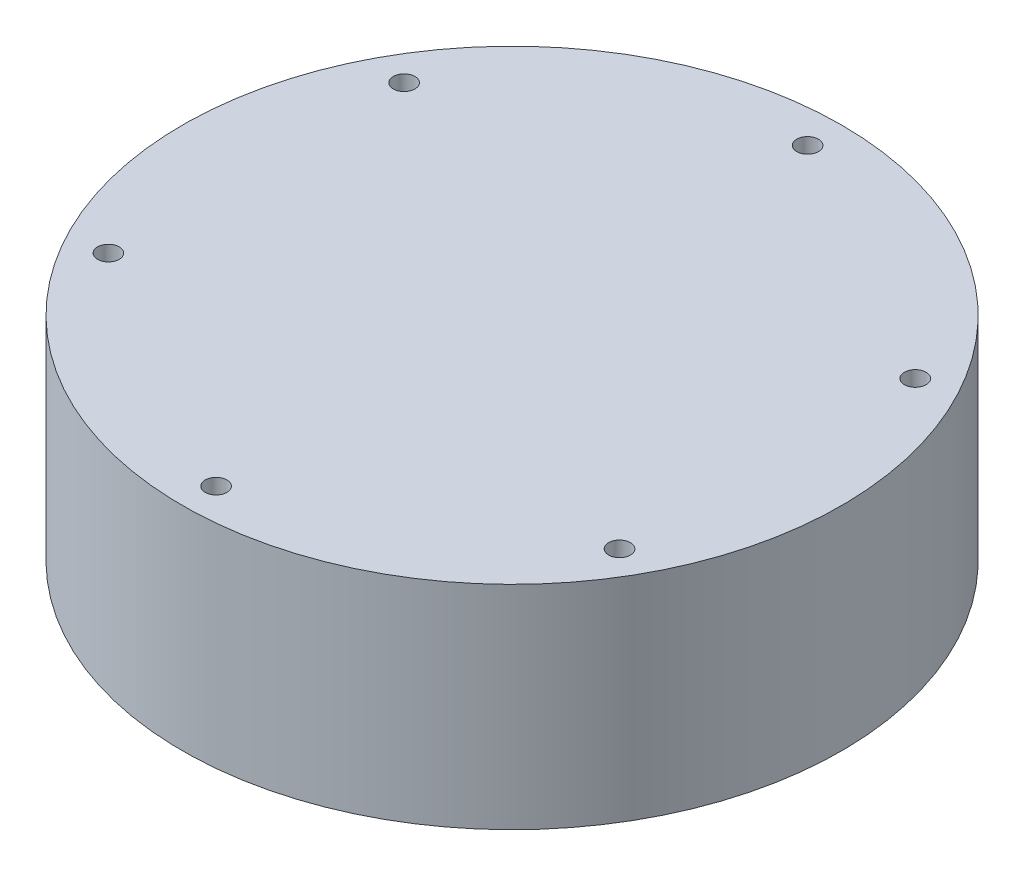
ISO-10303-21;
HEADER;
FILE_DESCRIPTION(('STEP AP214'),'2;1');
FILE_NAME('part.step','',(''),(''),'','','');
FILE_SCHEMA(('AUTOMOTIVE_DESIGN { 1 0 10303 214 1 1 1 1 }'));
ENDSEC;
DATA;
#1=APPLICATION_CONTEXT('core data for automotive mechanical design processes');
#2=APPLICATION_PROTOCOL_DEFINITION('international standard','automotive_design',2000,#1);
#3=PRODUCT_CONTEXT('',#1,'mechanical');
#4=PRODUCT('Part','Part','',(#3));
#5=PRODUCT_RELATED_PRODUCT_CATEGORY('part','',(#4));
#6=PRODUCT_DEFINITION_FORMATION('','',#4);
#7=PRODUCT_DEFINITION_CONTEXT('part definition',#1,'design');
#8=PRODUCT_DEFINITION('design','',#6,#7);
#9=PRODUCT_DEFINITION_SHAPE('','',#8);
#10=(LENGTH_UNIT() NAMED_UNIT(*) SI_UNIT(.MILLI.,.METRE.));
#11=(NAMED_UNIT(*) PLANE_ANGLE_UNIT() SI_UNIT($,.RADIAN.));
#12=(NAMED_UNIT(*) SI_UNIT($,.STERADIAN.) SOLID_ANGLE_UNIT());
#13=UNCERTAINTY_MEASURE_WITH_UNIT(LENGTH_MEASURE(1.E-05),#10,'distance_accuracy_value','');
#14=(GEOMETRIC_REPRESENTATION_CONTEXT(3) GLOBAL_UNCERTAINTY_ASSIGNED_CONTEXT((#13)) GLOBAL_UNIT_ASSIGNED_CONTEXT((#10,
#11,#12)) REPRESENTATION_CONTEXT('',''));
#15=CARTESIAN_POINT('',(0.,0.,0.));
#16=DIRECTION('',(0.,0.,1.));
#17=DIRECTION('',(1.,0.,0.));
#18=AXIS2_PLACEMENT_3D('',#15,#16,#17);
#19=CARTESIAN_POINT('',(0.,1.1,10.));
#20=DIRECTION('',(0.,-1.,0.));
#21=DIRECTION('',(0.,0.,-1.));
#22=AXIS2_PLACEMENT_3D('',#19,#20,#21);
#23=PLANE('',#22);
#24=CARTESIAN_POINT('',(0.,1.1,10.));
#25=DIRECTION('',(0.,-1.,0.));
#26=DIRECTION('',(0.,0.,-1.));
#27=AXIS2_PLACEMENT_3D('',#24,#25,#26);
#28=CIRCLE('',#27,1.5);
#29=CARTESIAN_POINT('',(0.,1.1,8.5));
#30=VERTEX_POINT('',#29);
#31=EDGE_CURVE('E19',#30,#30,#28,.T.);
#32=ORIENTED_EDGE('',*,*,#31,.T.);
#33=EDGE_LOOP('',(#32));
#34=FACE_BOUND('',#33,.T.);
#35=ADVANCED_FACE('F16',(#34),#23,.T.);
#36=CARTESIAN_POINT('',(-4.9632848167397,3.49999999997408,8.59666147502877));
#37=DIRECTION('',(0.,-1.,0.));
#38=DIRECTION('',(1.,0.,0.));
#39=AXIS2_PLACEMENT_3D('',#36,#37,#38);
#40=CONICAL_SURFACE('',#39,1.24999999994599,1.02974425862451);
#41=CARTESIAN_POINT('',(-4.9632848167397,4.25107577373751,8.59666147497192));
#42=VERTEX_POINT('',#41);
#43=VERTEX_LOOP('',#42);
#44=FACE_BOUND('',#43,.T.);
#45=CARTESIAN_POINT('',(-4.9632848167397,3.5,8.59666147502877));
#46=DIRECTION('',(0.,-1.,0.));
#47=DIRECTION('',(0.,0.,-1.));
#48=AXIS2_PLACEMENT_3D('',#45,#46,#47);
#49=CIRCLE('',#48,1.24999999999999);
#50=CARTESIAN_POINT('',(-4.9632848167397,3.5,7.34666147502877));
#51=VERTEX_POINT('',#50);
#52=EDGE_CURVE('E86',#51,#51,#49,.T.);
#53=ORIENTED_EDGE('',*,*,#52,.T.);
#54=EDGE_LOOP('',(#53));
#55=FACE_BOUND('',#54,.T.);
#56=ADVANCED_FACE('F80',(#44,#55),#40,.F.);
#57=CARTESIAN_POINT('',(-9.88985445021947,3.50000000003092,-0.0635925628154066));
#58=DIRECTION('',(0.,-1.,0.));
#59=DIRECTION('',(0.,0.,-1.));
#60=AXIS2_PLACEMENT_3D('',#57,#58,#59);
#61=CONICAL_SURFACE('',#60,1.25000000002218,1.02974425867833);
#62=CARTESIAN_POINT('',(-9.88985445021947,4.25107577382278,-0.0635925628154066));
#63=VERTEX_POINT('',#62);
#64=VERTEX_LOOP('',#63);
#65=FACE_BOUND('',#64,.T.);
#66=CARTESIAN_POINT('',(-9.88985445021947,3.5,-0.0635925628154066));
#67=DIRECTION('',(0.,-1.,0.));
#68=DIRECTION('',(0.,0.,-1.));
#69=AXIS2_PLACEMENT_3D('',#66,#67,#68);
#70=CIRCLE('',#69,1.24999999999999);
#71=CARTESIAN_POINT('',(-9.88985445021947,3.5,-1.3135925628154));
#72=VERTEX_POINT('',#71);
#73=EDGE_CURVE('E88',#72,#72,#70,.T.);
#74=ORIENTED_EDGE('',*,*,#73,.T.);
#75=EDGE_LOOP('',(#74));
#76=FACE_BOUND('',#75,.T.);
#77=ADVANCED_FACE('F83',(#65,#76),#61,.F.);
#78=CARTESIAN_POINT('',(-4.85313926695954,3.49999999997408,-8.66025403784397));
#79=DIRECTION('',(0.,-1.,0.));
#80=DIRECTION('',(1.,0.,0.));
#81=AXIS2_PLACEMENT_3D('',#78,#79,#80);
#82=CONICAL_SURFACE('',#81,1.25000000004684,1.02974425868194);
#83=CARTESIAN_POINT('',(-4.85313926695954,4.25107577376593,-8.66025403784397));
#84=VERTEX_POINT('',#83);
#85=VERTEX_LOOP('',#84);
#86=FACE_BOUND('',#85,.T.);
#87=CARTESIAN_POINT('',(-4.85313926695954,3.5,-8.66025403784397));
#88=DIRECTION('',(0.,-1.,0.));
#89=DIRECTION('',(0.,0.,-1.));
#90=AXIS2_PLACEMENT_3D('',#87,#88,#89);
#91=CIRCLE('',#90,1.24999999999999);
#92=CARTESIAN_POINT('',(-4.85313926695954,3.5,-9.91025403784396));
#93=VERTEX_POINT('',#92);
#94=EDGE_CURVE('E91',#93,#93,#91,.T.);
#95=ORIENTED_EDGE('',*,*,#94,.T.);
#96=EDGE_LOOP('',(#95));
#97=FACE_BOUND('',#96,.T.);
#98=ADVANCED_FACE('F193',(#86,#97),#82,.F.);
#99=CARTESIAN_POINT('',(5.11014554978017,3.50000000008777,-8.59666147502835));
#100=DIRECTION('',(0.,-1.,0.));
#101=DIRECTION('',(0.,0.,-1.));
#102=AXIS2_PLACEMENT_3D('',#99,#100,#101);
#103=CONICAL_SURFACE('',#102,1.24999999976794,1.0297442583717);
#104=CARTESIAN_POINT('',(5.11014554978017,4.2510757738512,-8.59666147505678));
#105=VERTEX_POINT('',#104);
#106=VERTEX_LOOP('',#105);
#107=FACE_BOUND('',#106,.T.);
#108=CARTESIAN_POINT('',(5.11014554978017,3.5,-8.59666147502835));
#109=DIRECTION('',(0.,-1.,0.));
#110=DIRECTION('',(0.,0.,-1.));
#111=AXIS2_PLACEMENT_3D('',#108,#109,#110);
#112=CIRCLE('',#111,1.24999999999999);
#113=CARTESIAN_POINT('',(5.11014554978017,3.5,-9.84666147502835));
#114=VERTEX_POINT('',#113);
#115=EDGE_CURVE('E184',#114,#114,#112,.T.);
#116=ORIENTED_EDGE('',*,*,#115,.T.);
#117=EDGE_LOOP('',(#116));
#118=FACE_BOUND('',#117,.T.);
#119=ADVANCED_FACE('F359',(#107,#118),#103,.F.);
#120=CARTESIAN_POINT('',(10.0367151832599,3.49999999991724,0.0635925628158212));
#121=DIRECTION('',(0.,-1.,0.));
#122=DIRECTION('',(0.,0.,-1.));
#123=AXIS2_PLACEMENT_3D('',#120,#121,#122);
#124=CONICAL_SURFACE('',#123,1.25000000003281,1.02974425866186);
#125=CARTESIAN_POINT('',(10.0367151832599,4.25107577370909,0.0635925628158212));
#126=VERTEX_POINT('',#125);
#127=VERTEX_LOOP('',#126);
#128=FACE_BOUND('',#127,.T.);
#129=CARTESIAN_POINT('',(10.0367151832599,3.5,0.0635925628158212));
#130=DIRECTION('',(0.,-1.,0.));
#131=DIRECTION('',(0.,0.,-1.));
#132=AXIS2_PLACEMENT_3D('',#129,#130,#131);
#133=CIRCLE('',#132,1.24999999999999);
#134=CARTESIAN_POINT('',(10.0367151832599,3.5,-1.18640743718417));
#135=VERTEX_POINT('',#134);
#136=EDGE_CURVE('E179',#135,#135,#133,.T.);
#137=ORIENTED_EDGE('',*,*,#136,.T.);
#138=EDGE_LOOP('',(#137));
#139=FACE_BOUND('',#138,.T.);
#140=ADVANCED_FACE('F356',(#128,#139),#124,.F.);
#141=CARTESIAN_POINT('',(5.00000000000001,3.49999999997408,8.66025403784438));
#142=DIRECTION('',(0.,-1.,0.));
#143=DIRECTION('',(1.,0.,0.));
#144=AXIS2_PLACEMENT_3D('',#141,#142,#143);
#145=CONICAL_SURFACE('',#144,1.2499999999513,1.02974425864834);
#146=CARTESIAN_POINT('',(5.00000000000001,4.25107577376593,8.66025403784438));
#147=VERTEX_POINT('',#146);
#148=VERTEX_LOOP('',#147);
#149=FACE_BOUND('',#148,.T.);
#150=CARTESIAN_POINT('',(5.00000000000001,3.5,8.66025403784438));
#151=DIRECTION('',(0.,-1.,0.));
#152=DIRECTION('',(0.,0.,-1.));
#153=AXIS2_PLACEMENT_3D('',#150,#151,#152);
#154=CIRCLE('',#153,1.24999999999999);
#155=CARTESIAN_POINT('',(5.00000000000001,3.5,7.41025403784439));
#156=VERTEX_POINT('',#155);
#157=EDGE_CURVE('E175',#156,#156,#154,.T.);
#158=ORIENTED_EDGE('',*,*,#157,.T.);
#159=EDGE_LOOP('',(#158));
#160=FACE_BOUND('',#159,.T.);
#161=ADVANCED_FACE('F358',(#149,#160),#145,.F.);
#162=CARTESIAN_POINT('',(0.,0.,0.));
#163=DIRECTION('',(0.,-1.,0.));
#164=DIRECTION('',(0.,0.,-1.));
#165=AXIS2_PLACEMENT_3D('',#162,#163,#164);
#166=PLANE('',#165);
#167=CARTESIAN_POINT('',(0.,0.,0.));
#168=DIRECTION('',(0.,-1.,0.));
#169=DIRECTION('',(0.,0.,-1.));
#170=AXIS2_PLACEMENT_3D('',#167,#168,#169);
#171=CIRCLE('',#170,4.5);
#172=CARTESIAN_POINT('',(0.,0.,-4.5));
#173=VERTEX_POINT('',#172);
#174=EDGE_CURVE('E173',#173,#173,#171,.T.);
#175=ORIENTED_EDGE('',*,*,#174,.T.);
#176=EDGE_LOOP('',(#175));
#177=FACE_BOUND('',#176,.T.);
#178=ADVANCED_FACE('F366',(#177),#166,.T.);
#179=CARTESIAN_POINT('',(0.,1.1,10.));
#180=DIRECTION('',(0.,-1.,0.));
#181=DIRECTION('',(0.,0.,-1.));
#182=AXIS2_PLACEMENT_3D('',#179,#180,#181);
#183=CYLINDRICAL_SURFACE('',#182,1.5);
#184=CARTESIAN_POINT('',(0.,-1.5,10.));
#185=DIRECTION('',(0.,-1.,0.));
#186=DIRECTION('',(0.,0.,-1.));
#187=AXIS2_PLACEMENT_3D('',#184,#185,#186);
#188=CIRCLE('',#187,1.5);
#189=CARTESIAN_POINT('',(0.,-1.5,8.5));
#190=VERTEX_POINT('',#189);
#191=EDGE_CURVE('E171',#190,#190,#188,.F.);
#192=ORIENTED_EDGE('',*,*,#191,.F.);
#193=EDGE_LOOP('',(#192));
#194=FACE_BOUND('',#193,.T.);
#195=ORIENTED_EDGE('',*,*,#31,.F.);
#196=EDGE_LOOP('',(#195));
#197=FACE_BOUND('',#196,.T.);
#198=ADVANCED_FACE('F417',(#194,#197),#183,.F.);
#199=CARTESIAN_POINT('',(-4.9632848167397,-1.5,8.59666147502877));
#200=DIRECTION('',(0.,-1.,0.));
#201=DIRECTION('',(0.,0.,-1.));
#202=AXIS2_PLACEMENT_3D('',#199,#200,#201);
#203=CYLINDRICAL_SURFACE('',#202,1.24999999999999);
#204=CARTESIAN_POINT('',(-4.9632848167397,-1.5,8.59666147502877));
#205=DIRECTION('',(0.,-1.,0.));
#206=DIRECTION('',(0.,0.,-1.));
#207=AXIS2_PLACEMENT_3D('',#204,#205,#206);
#208=CIRCLE('',#207,1.24999999999999);
#209=CARTESIAN_POINT('',(-4.9632848167397,-1.5,7.34666147502877));
#210=VERTEX_POINT('',#209);
#211=EDGE_CURVE('E168',#210,#210,#208,.F.);
#212=ORIENTED_EDGE('',*,*,#211,.F.);
#213=EDGE_LOOP('',(#212));
#214=FACE_BOUND('',#213,.T.);
#215=ORIENTED_EDGE('',*,*,#52,.F.);
#216=EDGE_LOOP('',(#215));
#217=FACE_BOUND('',#216,.T.);
#218=ADVANCED_FACE('F209',(#214,#217),#203,.F.);
#219=CARTESIAN_POINT('',(-9.88985445021947,-1.5,-0.0635925628154066));
#220=DIRECTION('',(0.,-1.,0.));
#221=DIRECTION('',(0.,0.,-1.));
#222=AXIS2_PLACEMENT_3D('',#219,#220,#221);
#223=CYLINDRICAL_SURFACE('',#222,1.24999999999999);
#224=CARTESIAN_POINT('',(-9.88985445021947,-1.5,-0.0635925628154066));
#225=DIRECTION('',(0.,-1.,0.));
#226=DIRECTION('',(0.,0.,-1.));
#227=AXIS2_PLACEMENT_3D('',#224,#225,#226);
#228=CIRCLE('',#227,1.24999999999999);
#229=CARTESIAN_POINT('',(-9.88985445021947,-1.5,-1.3135925628154));
#230=VERTEX_POINT('',#229);
#231=EDGE_CURVE('E165',#230,#230,#228,.F.);
#232=ORIENTED_EDGE('',*,*,#231,.F.);
#233=EDGE_LOOP('',(#232));
#234=FACE_BOUND('',#233,.T.);
#235=ORIENTED_EDGE('',*,*,#73,.F.);
#236=EDGE_LOOP('',(#235));
#237=FACE_BOUND('',#236,.T.);
#238=ADVANCED_FACE('F198',(#234,#237),#223,.F.);
#239=CARTESIAN_POINT('',(-4.85313926695954,-1.5,-8.66025403784397));
#240=DIRECTION('',(0.,-1.,0.));
#241=DIRECTION('',(0.,0.,-1.));
#242=AXIS2_PLACEMENT_3D('',#239,#240,#241);
#243=CYLINDRICAL_SURFACE('',#242,1.24999999999999);
#244=CARTESIAN_POINT('',(-4.85313926695954,-1.5,-8.66025403784397));
#245=DIRECTION('',(0.,-1.,0.));
#246=DIRECTION('',(0.,0.,-1.));
#247=AXIS2_PLACEMENT_3D('',#244,#245,#246);
#248=CIRCLE('',#247,1.24999999999999);
#249=CARTESIAN_POINT('',(-4.85313926695954,-1.5,-9.91025403784396));
#250=VERTEX_POINT('',#249);
#251=EDGE_CURVE('E162',#250,#250,#248,.F.);
#252=ORIENTED_EDGE('',*,*,#251,.F.);
#253=EDGE_LOOP('',(#252));
#254=FACE_BOUND('',#253,.T.);
#255=ORIENTED_EDGE('',*,*,#94,.F.);
#256=EDGE_LOOP('',(#255));
#257=FACE_BOUND('',#256,.T.);
#258=ADVANCED_FACE('F195',(#254,#257),#243,.F.);
#259=CARTESIAN_POINT('',(5.11014554978017,-1.5,-8.59666147502835));
#260=DIRECTION('',(0.,-1.,0.));
#261=DIRECTION('',(0.,0.,-1.));
#262=AXIS2_PLACEMENT_3D('',#259,#260,#261);
#263=CYLINDRICAL_SURFACE('',#262,1.24999999999999);
#264=CARTESIAN_POINT('',(5.11014554978017,-1.5,-8.59666147502835));
#265=DIRECTION('',(0.,-1.,0.));
#266=DIRECTION('',(0.,0.,-1.));
#267=AXIS2_PLACEMENT_3D('',#264,#265,#266);
#268=CIRCLE('',#267,1.24999999999999);
#269=CARTESIAN_POINT('',(5.11014554978017,-1.5,-9.84666147502835));
#270=VERTEX_POINT('',#269);
#271=EDGE_CURVE('E159',#270,#270,#268,.F.);
#272=ORIENTED_EDGE('',*,*,#271,.F.);
#273=EDGE_LOOP('',(#272));
#274=FACE_BOUND('',#273,.T.);
#275=ORIENTED_EDGE('',*,*,#115,.F.);
#276=EDGE_LOOP('',(#275));
#277=FACE_BOUND('',#276,.T.);
#278=ADVANCED_FACE('F197',(#274,#277),#263,.F.);
#279=CARTESIAN_POINT('',(10.0367151832599,-1.5,0.0635925628158212));
#280=DIRECTION('',(0.,-1.,0.));
#281=DIRECTION('',(0.,0.,-1.));
#282=AXIS2_PLACEMENT_3D('',#279,#280,#281);
#283=CYLINDRICAL_SURFACE('',#282,1.24999999999999);
#284=CARTESIAN_POINT('',(10.0367151832599,-1.5,0.0635925628158212));
#285=DIRECTION('',(0.,-1.,0.));
#286=DIRECTION('',(0.,0.,-1.));
#287=AXIS2_PLACEMENT_3D('',#284,#285,#286);
#288=CIRCLE('',#287,1.24999999999999);
#289=CARTESIAN_POINT('',(10.0367151832599,-1.5,-1.18640743718417));
#290=VERTEX_POINT('',#289);
#291=EDGE_CURVE('E156',#290,#290,#288,.F.);
#292=ORIENTED_EDGE('',*,*,#291,.F.);
#293=EDGE_LOOP('',(#292));
#294=FACE_BOUND('',#293,.T.);
#295=ORIENTED_EDGE('',*,*,#136,.F.);
#296=EDGE_LOOP('',(#295));
#297=FACE_BOUND('',#296,.T.);
#298=ADVANCED_FACE('F206',(#294,#297),#283,.F.);
#299=CARTESIAN_POINT('',(5.00000000000001,-1.5,8.66025403784438));
#300=DIRECTION('',(0.,-1.,0.));
#301=DIRECTION('',(0.,0.,-1.));
#302=AXIS2_PLACEMENT_3D('',#299,#300,#301);
#303=CYLINDRICAL_SURFACE('',#302,1.24999999999999);
#304=CARTESIAN_POINT('',(5.00000000000001,-1.5,8.66025403784438));
#305=DIRECTION('',(0.,-1.,0.));
#306=DIRECTION('',(0.,0.,-1.));
#307=AXIS2_PLACEMENT_3D('',#304,#305,#306);
#308=CIRCLE('',#307,1.24999999999999);
#309=CARTESIAN_POINT('',(5.00000000000001,-1.5,7.41025403784439));
#310=VERTEX_POINT('',#309);
#311=EDGE_CURVE('E153',#310,#310,#308,.F.);
#312=ORIENTED_EDGE('',*,*,#311,.F.);
#313=EDGE_LOOP('',(#312));
#314=FACE_BOUND('',#313,.T.);
#315=ORIENTED_EDGE('',*,*,#157,.F.);
#316=EDGE_LOOP('',(#315));
#317=FACE_BOUND('',#316,.T.);
#318=ADVANCED_FACE('F343',(#314,#317),#303,.F.);
#319=CARTESIAN_POINT('',(0.,0.,0.));
#320=DIRECTION('',(0.,-1.,0.));
#321=DIRECTION('',(0.,0.,-1.));
#322=AXIS2_PLACEMENT_3D('',#319,#320,#321);
#323=CYLINDRICAL_SURFACE('',#322,4.5);
#324=CARTESIAN_POINT('',(0.,-1.5,0.));
#325=DIRECTION('',(0.,-1.,0.));
#326=DIRECTION('',(0.,0.,-1.));
#327=AXIS2_PLACEMENT_3D('',#324,#325,#326);
#328=CIRCLE('',#327,4.5);
#329=CARTESIAN_POINT('',(0.,-1.5,-4.5));
#330=VERTEX_POINT('',#329);
#331=EDGE_CURVE('E150',#330,#330,#328,.F.);
#332=ORIENTED_EDGE('',*,*,#331,.F.);
#333=EDGE_LOOP('',(#332));
#334=FACE_BOUND('',#333,.T.);
#335=ORIENTED_EDGE('',*,*,#174,.F.);
#336=EDGE_LOOP('',(#335));
#337=FACE_BOUND('',#336,.T.);
#338=ADVANCED_FACE('F339',(#334,#337),#323,.F.);
#339=CARTESIAN_POINT('',(4.5,-1.5,0.));
#340=DIRECTION('',(0.,-1.,0.));
#341=DIRECTION('',(0.,0.,-1.));
#342=AXIS2_PLACEMENT_3D('',#339,#340,#341);
#343=PLANE('',#342);
#344=ORIENTED_EDGE('',*,*,#331,.T.);
#345=EDGE_LOOP('',(#344));
#346=FACE_BOUND('',#345,.T.);
#347=CARTESIAN_POINT('',(0.,-1.5,0.));
#348=DIRECTION('',(0.,-1.,0.));
#349=DIRECTION('',(0.,0.,-1.));
#350=AXIS2_PLACEMENT_3D('',#347,#348,#349);
#351=CIRCLE('',#350,14.);
#352=CARTESIAN_POINT('',(0.,-1.5,-14.));
#353=VERTEX_POINT('',#352);
#354=EDGE_CURVE('E147',#353,#353,#351,.F.);
#355=ORIENTED_EDGE('',*,*,#354,.F.);
#356=EDGE_LOOP('',(#355));
#357=FACE_BOUND('',#356,.T.);
#358=ORIENTED_EDGE('',*,*,#311,.T.);
#359=EDGE_LOOP('',(#358));
#360=FACE_BOUND('',#359,.T.);
#361=ORIENTED_EDGE('',*,*,#291,.T.);
#362=EDGE_LOOP('',(#361));
#363=FACE_BOUND('',#362,.T.);
#364=ORIENTED_EDGE('',*,*,#271,.T.);
#365=EDGE_LOOP('',(#364));
#366=FACE_BOUND('',#365,.T.);
#367=ORIENTED_EDGE('',*,*,#251,.T.);
#368=EDGE_LOOP('',(#367));
#369=FACE_BOUND('',#368,.T.);
#370=ORIENTED_EDGE('',*,*,#231,.T.);
#371=EDGE_LOOP('',(#370));
#372=FACE_BOUND('',#371,.T.);
#373=ORIENTED_EDGE('',*,*,#211,.T.);
#374=EDGE_LOOP('',(#373));
#375=FACE_BOUND('',#374,.T.);
#376=ORIENTED_EDGE('',*,*,#191,.T.);
#377=EDGE_LOOP('',(#376));
#378=FACE_BOUND('',#377,.T.);
#379=ADVANCED_FACE('F335',(#346,#357,#360,#363,#366,#369,#372,#375,#378),#343,.T.);
#380=CARTESIAN_POINT('',(0.,0.,0.));
#381=DIRECTION('',(0.,-1.,0.));
#382=DIRECTION('',(0.,0.,-1.));
#383=AXIS2_PLACEMENT_3D('',#380,#381,#382);
#384=CYLINDRICAL_SURFACE('',#383,14.);
#385=CARTESIAN_POINT('',(0.,-1.,0.));
#386=DIRECTION('',(0.,-1.,0.));
#387=DIRECTION('',(0.,0.,-1.));
#388=AXIS2_PLACEMENT_3D('',#385,#386,#387);
#389=CIRCLE('',#388,14.);
#390=CARTESIAN_POINT('',(0.,-1.,-14.));
#391=VERTEX_POINT('',#390);
#392=EDGE_CURVE('E143',#391,#391,#389,.F.);
#393=ORIENTED_EDGE('',*,*,#392,.F.);
#394=EDGE_LOOP('',(#393));
#395=FACE_BOUND('',#394,.T.);
#396=ORIENTED_EDGE('',*,*,#354,.T.);
#397=EDGE_LOOP('',(#396));
#398=FACE_BOUND('',#397,.T.);
#399=ADVANCED_FACE('F331',(#395,#398),#384,.T.);
#400=CARTESIAN_POINT('',(-29.4448637286704,3.50000000003092,16.9999999999988));
#401=DIRECTION('',(0.,-1.,0.));
#402=DIRECTION('',(0.,0.,-1.));
#403=AXIS2_PLACEMENT_3D('',#400,#401,#402);
#404=CONICAL_SURFACE('',#403,1.24999999997335,1.02974425870861);
#405=CARTESIAN_POINT('',(-29.4448637286704,4.25107577370909,16.9999999999959));
#406=VERTEX_POINT('',#405);
#407=VERTEX_LOOP('',#406);
#408=FACE_BOUND('',#407,.T.);
#409=CARTESIAN_POINT('',(-29.4448637286704,3.5,16.9999999999988));
#410=DIRECTION('',(0.,-1.,0.));
#411=DIRECTION('',(0.,0.,-1.));
#412=AXIS2_PLACEMENT_3D('',#409,#410,#411);
#413=CIRCLE('',#412,1.24999999999999);
#414=CARTESIAN_POINT('',(-29.4448637286704,3.5,15.7499999999988));
#415=VERTEX_POINT('',#414);
#416=EDGE_CURVE('E146',#415,#415,#413,.T.);
#417=ORIENTED_EDGE('',*,*,#416,.T.);
#418=EDGE_LOOP('',(#417));
#419=FACE_BOUND('',#418,.T.);
#420=ADVANCED_FACE('F327',(#408,#419),#404,.F.);
#421=CARTESIAN_POINT('',(-29.481578911929,3.49999999997408,-17.0635925628171));
#422=DIRECTION('',(0.,-1.,0.));
#423=DIRECTION('',(1.,0.,0.));
#424=AXIS2_PLACEMENT_3D('',#421,#422,#423);
#425=CONICAL_SURFACE('',#424,1.25000000007321,1.02974425866186);
#426=CARTESIAN_POINT('',(-29.481578911929,4.25107577379435,-17.0635925628631));
#427=VERTEX_POINT('',#426);
#428=VERTEX_LOOP('',#427);
#429=FACE_BOUND('',#428,.T.);
#430=CARTESIAN_POINT('',(-29.481578911929,3.5,-17.0635925628171));
#431=DIRECTION('',(0.,-1.,0.));
#432=DIRECTION('',(0.,0.,-1.));
#433=AXIS2_PLACEMENT_3D('',#430,#431,#432);
#434=CIRCLE('',#433,1.24999999999999);
#435=CARTESIAN_POINT('',(-29.481578911929,3.5,-18.3135925628171));
#436=VERTEX_POINT('',#435);
#437=EDGE_CURVE('E776',#436,#436,#434,.T.);
#438=ORIENTED_EDGE('',*,*,#437,.T.);
#439=EDGE_LOOP('',(#438));
#440=FACE_BOUND('',#439,.T.);
#441=ADVANCED_FACE('F323',(#429,#440),#425,.F.);
#442=CARTESIAN_POINT('',(29.5182940951935,3.50000000003092,-17.1271851256303));
#443=DIRECTION('',(0.,-1.,0.));
#444=DIRECTION('',(0.,0.,-1.));
#445=AXIS2_PLACEMENT_3D('',#442,#443,#444);
#446=CONICAL_SURFACE('',#445,1.24999999995663,1.0297442586752);
#447=CARTESIAN_POINT('',(29.5182940951935,4.25107577382278,-17.1271851256165));
#448=VERTEX_POINT('',#447);
#449=VERTEX_LOOP('',#448);
#450=FACE_BOUND('',#449,.T.);
#451=CARTESIAN_POINT('',(29.5182940951935,3.5,-17.1271851256303));
#452=DIRECTION('',(0.,-1.,0.));
#453=DIRECTION('',(0.,0.,-1.));
#454=AXIS2_PLACEMENT_3D('',#451,#452,#453);
#455=CIRCLE('',#454,1.24999999999999);
#456=CARTESIAN_POINT('',(29.5182940951935,3.5,-18.3771851256303));
#457=VERTEX_POINT('',#456);
#458=EDGE_CURVE('E778',#457,#457,#455,.T.);
#459=ORIENTED_EDGE('',*,*,#458,.T.);
#460=EDGE_LOOP('',(#459));
#461=FACE_BOUND('',#460,.T.);
#462=ADVANCED_FACE('F319',(#450,#461),#446,.F.);
#463=CARTESIAN_POINT('',(29.5550092784522,3.49999999991724,16.9364074371856));
#464=DIRECTION('',(0.,-1.,0.));
#465=DIRECTION('',(0.,0.,-1.));
#466=AXIS2_PLACEMENT_3D('',#463,#464,#465);
#467=CONICAL_SURFACE('',#466,1.25000000014101,1.02974425868194);
#468=CARTESIAN_POINT('',(29.5550092784522,4.25107577373751,16.9364074371572));
#469=VERTEX_POINT('',#468);
#470=VERTEX_LOOP('',#469);
#471=FACE_BOUND('',#470,.T.);
#472=CARTESIAN_POINT('',(29.5550092784522,3.5,16.9364074371856));
#473=DIRECTION('',(0.,-1.,0.));
#474=DIRECTION('',(0.,0.,-1.));
#475=AXIS2_PLACEMENT_3D('',#472,#473,#474);
#476=CIRCLE('',#475,1.24999999999999);
#477=CARTESIAN_POINT('',(29.5550092784522,3.5,15.6864074371856));
#478=VERTEX_POINT('',#477);
#479=EDGE_CURVE('E782',#478,#478,#476,.T.);
#480=ORIENTED_EDGE('',*,*,#479,.T.);
#481=EDGE_LOOP('',(#480));
#482=FACE_BOUND('',#481,.T.);
#483=ADVANCED_FACE('F315',(#471,#482),#467,.F.);
#484=CARTESIAN_POINT('',(2.90739654573713E-12,3.50000000008777,-34.1271851256317));
#485=DIRECTION('',(0.,-1.,0.));
#486=DIRECTION('',(0.,0.,-1.));
#487=AXIS2_PLACEMENT_3D('',#484,#485,#486);
#488=CONICAL_SURFACE('',#487,1.24999999983748,1.02974425840074);
#489=CARTESIAN_POINT('',(2.90739654688984E-12,4.2510757738512,-34.1271851256885));
#490=VERTEX_POINT('',#489);
#491=VERTEX_LOOP('',#490);
#492=FACE_BOUND('',#491,.T.);
#493=CARTESIAN_POINT('',(2.90739654573713E-12,3.5,-34.1271851256317));
#494=DIRECTION('',(0.,-1.,0.));
#495=DIRECTION('',(0.,0.,-1.));
#496=AXIS2_PLACEMENT_3D('',#493,#494,#495);
#497=CIRCLE('',#496,1.24999999999999);
#498=CARTESIAN_POINT('',(2.90739654573713E-12,3.5,-35.3771851256317));
#499=VERTEX_POINT('',#498);
#500=EDGE_CURVE('E787',#499,#499,#497,.T.);
#501=ORIENTED_EDGE('',*,*,#500,.T.);
#502=EDGE_LOOP('',(#501));
#503=FACE_BOUND('',#502,.T.);
#504=ADVANCED_FACE('F311',(#492,#503),#488,.F.);
#505=CARTESIAN_POINT('',(0.0734303665202336,3.50000000008777,34.0000000000002));
#506=DIRECTION('',(0.,-1.,0.));
#507=DIRECTION('',(0.,0.,-1.));
#508=AXIS2_PLACEMENT_3D('',#505,#506,#507);
#509=CONICAL_SURFACE('',#508,1.24999999980831,1.02974425840021);
#510=CARTESIAN_POINT('',(0.0734303665202336,4.2510757738512,33.9999999999434));
#511=VERTEX_POINT('',#510);
#512=VERTEX_LOOP('',#511);
#513=FACE_BOUND('',#512,.T.);
#514=CARTESIAN_POINT('',(0.0734303665202336,3.5,34.0000000000002));
#515=DIRECTION('',(0.,-1.,0.));
#516=DIRECTION('',(0.,0.,-1.));
#517=AXIS2_PLACEMENT_3D('',#514,#515,#516);
#518=CIRCLE('',#517,1.24999999999999);
#519=CARTESIAN_POINT('',(0.0734303665202336,3.5,32.7500000000002));
#520=VERTEX_POINT('',#519);
#521=EDGE_CURVE('E142',#520,#520,#518,.T.);
#522=ORIENTED_EDGE('',*,*,#521,.T.);
#523=EDGE_LOOP('',(#522));
#524=FACE_BOUND('',#523,.T.);
#525=ADVANCED_FACE('F307',(#513,#524),#509,.F.);
#526=CARTESIAN_POINT('',(14.,-1.,0.));
#527=DIRECTION('',(0.,-1.,0.));
#528=DIRECTION('',(0.,0.,-1.));
#529=AXIS2_PLACEMENT_3D('',#526,#527,#528);
#530=PLANE('',#529);
#531=ORIENTED_EDGE('',*,*,#392,.T.);
#532=EDGE_LOOP('',(#531));
#533=FACE_BOUND('',#532,.T.);
#534=CARTESIAN_POINT('',(0.,-1.,0.));
#535=DIRECTION('',(0.,-1.,0.));
#536=DIRECTION('',(0.,0.,-1.));
#537=AXIS2_PLACEMENT_3D('',#534,#535,#536);
#538=CIRCLE('',#537,20.5);
#539=CARTESIAN_POINT('',(0.,-1.,-20.5));
#540=VERTEX_POINT('',#539);
#541=EDGE_CURVE('E139',#540,#540,#538,.F.);
#542=ORIENTED_EDGE('',*,*,#541,.F.);
#543=EDGE_LOOP('',(#542));
#544=FACE_BOUND('',#543,.T.);
#545=ADVANCED_FACE('F303',(#533,#544),#530,.T.);
#546=CARTESIAN_POINT('',(-29.4448637286704,0.,16.9999999999988));
#547=DIRECTION('',(0.,-1.,0.));
#548=DIRECTION('',(0.,0.,-1.));
#549=AXIS2_PLACEMENT_3D('',#546,#547,#548);
#550=CYLINDRICAL_SURFACE('',#549,1.24999999999999);
#551=CARTESIAN_POINT('',(-29.4448637286704,0.,16.9999999999988));
#552=DIRECTION('',(0.,-1.,0.));
#553=DIRECTION('',(0.,0.,-1.));
#554=AXIS2_PLACEMENT_3D('',#551,#552,#553);
#555=CIRCLE('',#554,1.24999999999999);
#556=CARTESIAN_POINT('',(-29.4448637286704,0.,15.7499999999988));
#557=VERTEX_POINT('',#556);
#558=EDGE_CURVE('E136',#557,#557,#555,.F.);
#559=ORIENTED_EDGE('',*,*,#558,.F.);
#560=EDGE_LOOP('',(#559));
#561=FACE_BOUND('',#560,.T.);
#562=ORIENTED_EDGE('',*,*,#416,.F.);
#563=EDGE_LOOP('',(#562));
#564=FACE_BOUND('',#563,.T.);
#565=ADVANCED_FACE('F299',(#561,#564),#550,.F.);
#566=CARTESIAN_POINT('',(-29.481578911929,0.,-17.0635925628171));
#567=DIRECTION('',(0.,-1.,0.));
#568=DIRECTION('',(0.,0.,-1.));
#569=AXIS2_PLACEMENT_3D('',#566,#567,#568);
#570=CYLINDRICAL_SURFACE('',#569,1.24999999999999);
#571=CARTESIAN_POINT('',(-29.481578911929,0.,-17.0635925628171));
#572=DIRECTION('',(0.,-1.,0.));
#573=DIRECTION('',(0.,0.,-1.));
#574=AXIS2_PLACEMENT_3D('',#571,#572,#573);
#575=CIRCLE('',#574,1.24999999999999);
#576=CARTESIAN_POINT('',(-29.481578911929,0.,-18.3135925628171));
#577=VERTEX_POINT('',#576);
#578=EDGE_CURVE('E133',#577,#577,#575,.F.);
#579=ORIENTED_EDGE('',*,*,#578,.F.);
#580=EDGE_LOOP('',(#579));
#581=FACE_BOUND('',#580,.T.);
#582=ORIENTED_EDGE('',*,*,#437,.F.);
#583=EDGE_LOOP('',(#582));
#584=FACE_BOUND('',#583,.T.);
#585=ADVANCED_FACE('F295',(#581,#584),#570,.F.);
#586=CARTESIAN_POINT('',(29.5182940951935,0.,-17.1271851256303));
#587=DIRECTION('',(0.,-1.,0.));
#588=DIRECTION('',(0.,0.,-1.));
#589=AXIS2_PLACEMENT_3D('',#586,#587,#588);
#590=CYLINDRICAL_SURFACE('',#589,1.24999999999999);
#591=CARTESIAN_POINT('',(29.5182940951935,0.,-17.1271851256303));
#592=DIRECTION('',(0.,-1.,0.));
#593=DIRECTION('',(0.,0.,-1.));
#594=AXIS2_PLACEMENT_3D('',#591,#592,#593);
#595=CIRCLE('',#594,1.24999999999999);
#596=CARTESIAN_POINT('',(29.5182940951935,0.,-18.3771851256303));
#597=VERTEX_POINT('',#596);
#598=EDGE_CURVE('E130',#597,#597,#595,.F.);
#599=ORIENTED_EDGE('',*,*,#598,.F.);
#600=EDGE_LOOP('',(#599));
#601=FACE_BOUND('',#600,.T.);
#602=ORIENTED_EDGE('',*,*,#458,.F.);
#603=EDGE_LOOP('',(#602));
#604=FACE_BOUND('',#603,.T.);
#605=ADVANCED_FACE('F291',(#601,#604),#590,.F.);
#606=CARTESIAN_POINT('',(29.5550092784522,0.,16.9364074371856));
#607=DIRECTION('',(0.,-1.,0.));
#608=DIRECTION('',(0.,0.,-1.));
#609=AXIS2_PLACEMENT_3D('',#606,#607,#608);
#610=CYLINDRICAL_SURFACE('',#609,1.24999999999999);
#611=CARTESIAN_POINT('',(29.5550092784522,0.,16.9364074371856));
#612=DIRECTION('',(0.,-1.,0.));
#613=DIRECTION('',(0.,0.,-1.));
#614=AXIS2_PLACEMENT_3D('',#611,#612,#613);
#615=CIRCLE('',#614,1.24999999999999);
#616=CARTESIAN_POINT('',(29.5550092784522,0.,15.6864074371856));
#617=VERTEX_POINT('',#616);
#618=EDGE_CURVE('E127',#617,#617,#615,.F.);
#619=ORIENTED_EDGE('',*,*,#618,.F.);
#620=EDGE_LOOP('',(#619));
#621=FACE_BOUND('',#620,.T.);
#622=ORIENTED_EDGE('',*,*,#479,.F.);
#623=EDGE_LOOP('',(#622));
#624=FACE_BOUND('',#623,.T.);
#625=ADVANCED_FACE('F287',(#621,#624),#610,.F.);
#626=CARTESIAN_POINT('',(2.90739654573713E-12,0.,-34.1271851256317));
#627=DIRECTION('',(0.,-1.,0.));
#628=DIRECTION('',(0.,0.,-1.));
#629=AXIS2_PLACEMENT_3D('',#626,#627,#628);
#630=CYLINDRICAL_SURFACE('',#629,1.24999999999999);
#631=CARTESIAN_POINT('',(2.90739654573713E-12,0.,-34.1271851256317));
#632=DIRECTION('',(0.,-1.,0.));
#633=DIRECTION('',(0.,0.,-1.));
#634=AXIS2_PLACEMENT_3D('',#631,#632,#633);
#635=CIRCLE('',#634,1.24999999999999);
#636=CARTESIAN_POINT('',(2.90739654573713E-12,0.,-35.3771851256317));
#637=VERTEX_POINT('',#636);
#638=EDGE_CURVE('E124',#637,#637,#635,.F.);
#639=ORIENTED_EDGE('',*,*,#638,.F.);
#640=EDGE_LOOP('',(#639));
#641=FACE_BOUND('',#640,.T.);
#642=ORIENTED_EDGE('',*,*,#500,.F.);
#643=EDGE_LOOP('',(#642));
#644=FACE_BOUND('',#643,.T.);
#645=ADVANCED_FACE('F283',(#641,#644),#630,.F.);
#646=CARTESIAN_POINT('',(0.0734303665202336,0.,34.0000000000002));
#647=DIRECTION('',(0.,-1.,0.));
#648=DIRECTION('',(0.,0.,-1.));
#649=AXIS2_PLACEMENT_3D('',#646,#647,#648);
#650=CYLINDRICAL_SURFACE('',#649,1.24999999999999);
#651=CARTESIAN_POINT('',(0.0734303665202336,0.,34.0000000000002));
#652=DIRECTION('',(0.,-1.,0.));
#653=DIRECTION('',(0.,0.,-1.));
#654=AXIS2_PLACEMENT_3D('',#651,#652,#653);
#655=CIRCLE('',#654,1.24999999999999);
#656=CARTESIAN_POINT('',(0.0734303665202336,0.,32.7500000000002));
#657=VERTEX_POINT('',#656);
#658=EDGE_CURVE('E121',#657,#657,#655,.F.);
#659=ORIENTED_EDGE('',*,*,#658,.F.);
#660=EDGE_LOOP('',(#659));
#661=FACE_BOUND('',#660,.T.);
#662=ORIENTED_EDGE('',*,*,#521,.F.);
#663=EDGE_LOOP('',(#662));
#664=FACE_BOUND('',#663,.T.);
#665=ADVANCED_FACE('F279',(#661,#664),#650,.F.);
#666=CARTESIAN_POINT('',(0.,0.,0.));
#667=DIRECTION('',(0.,-1.,0.));
#668=DIRECTION('',(0.,0.,-1.));
#669=AXIS2_PLACEMENT_3D('',#666,#667,#668);
#670=CYLINDRICAL_SURFACE('',#669,20.5);
#671=CARTESIAN_POINT('',(0.,0.,0.));
#672=DIRECTION('',(0.,-1.,0.));
#673=DIRECTION('',(0.,0.,-1.));
#674=AXIS2_PLACEMENT_3D('',#671,#672,#673);
#675=CIRCLE('',#674,20.5);
#676=CARTESIAN_POINT('',(0.,0.,-20.5));
#677=VERTEX_POINT('',#676);
#678=EDGE_CURVE('E117',#677,#677,#675,.F.);
#679=ORIENTED_EDGE('',*,*,#678,.F.);
#680=EDGE_LOOP('',(#679));
#681=FACE_BOUND('',#680,.T.);
#682=ORIENTED_EDGE('',*,*,#541,.T.);
#683=EDGE_LOOP('',(#682));
#684=FACE_BOUND('',#683,.T.);
#685=ADVANCED_FACE('F275',(#681,#684),#670,.T.);
#686=CARTESIAN_POINT('',(0.0734303665202336,21.000000000015,-33.9999999999998));
#687=DIRECTION('',(0.,1.,0.));
#688=DIRECTION('',(0.,0.,1.));
#689=AXIS2_PLACEMENT_3D('',#686,#687,#688);
#690=CONICAL_SURFACE('',#689,1.24999999992158,1.02974425860727);
#691=CARTESIAN_POINT('',(0.0734303665202336,20.2489242262516,-34.0000000000566));
#692=VERTEX_POINT('',#691);
#693=VERTEX_LOOP('',#692);
#694=FACE_BOUND('',#693,.T.);
#695=CARTESIAN_POINT('',(0.0734303665202336,21.,-33.9999999999998));
#696=DIRECTION('',(0.,1.,0.));
#697=DIRECTION('',(0.,0.,1.));
#698=AXIS2_PLACEMENT_3D('',#695,#696,#697);
#699=CIRCLE('',#698,1.24999999999999);
#700=CARTESIAN_POINT('',(0.0734303665202336,21.,-32.7499999999998));
#701=VERTEX_POINT('',#700);
#702=EDGE_CURVE('E120',#701,#701,#699,.T.);
#703=ORIENTED_EDGE('',*,*,#702,.T.);
#704=EDGE_LOOP('',(#703));
#705=FACE_BOUND('',#704,.T.);
#706=ADVANCED_FACE('F271',(#694,#705),#690,.F.);
#707=CARTESIAN_POINT('',(-29.4448637286694,20.9999999999013,-16.9999999999994));
#708=DIRECTION('',(0.,1.,0.));
#709=DIRECTION('',(0.,0.,1.));
#710=AXIS2_PLACEMENT_3D('',#707,#708,#709);
#711=CONICAL_SURFACE('',#710,1.24999999980345,1.02974425839678);
#712=CARTESIAN_POINT('',(-29.4448637286694,20.2489242261379,-17.000000000138));
#713=VERTEX_POINT('',#712);
#714=VERTEX_LOOP('',#713);
#715=FACE_BOUND('',#714,.T.);
#716=CARTESIAN_POINT('',(-29.4448637286694,21.,-16.9999999999994));
#717=DIRECTION('',(0.,1.,0.));
#718=DIRECTION('',(0.,0.,1.));
#719=AXIS2_PLACEMENT_3D('',#716,#717,#718);
#720=CIRCLE('',#719,1.24999999999999);
#721=CARTESIAN_POINT('',(-29.4448637286694,21.,-15.7499999999995));
#722=VERTEX_POINT('',#721);
#723=EDGE_CURVE('E794',#722,#722,#720,.T.);
#724=ORIENTED_EDGE('',*,*,#723,.T.);
#725=EDGE_LOOP('',(#724));
#726=FACE_BOUND('',#725,.T.);
#727=ADVANCED_FACE('F267',(#715,#726),#711,.F.);
#728=CARTESIAN_POINT('',(-29.4815789119284,20.9999999999013,17.0635925628151));
#729=DIRECTION('',(0.,1.,0.));
#730=DIRECTION('',(0.,0.,1.));
#731=AXIS2_PLACEMENT_3D('',#728,#729,#730);
#732=CONICAL_SURFACE('',#731,1.24999999984789,1.02974425842817);
#733=CARTESIAN_POINT('',(-29.4815789119284,20.2489242261095,17.0635925626073));
#734=VERTEX_POINT('',#733);
#735=VERTEX_LOOP('',#734);
#736=FACE_BOUND('',#735,.T.);
#737=CARTESIAN_POINT('',(-29.4815789119284,21.,17.0635925628151));
#738=DIRECTION('',(0.,1.,0.));
#739=DIRECTION('',(0.,0.,1.));
#740=AXIS2_PLACEMENT_3D('',#737,#738,#739);
#741=CIRCLE('',#740,1.24999999999999);
#742=CARTESIAN_POINT('',(-29.4815789119284,21.,18.3135925628151));
#743=VERTEX_POINT('',#742);
#744=EDGE_CURVE('E797',#743,#743,#741,.T.);
#745=ORIENTED_EDGE('',*,*,#744,.T.);
#746=EDGE_LOOP('',(#745));
#747=FACE_BOUND('',#746,.T.);
#748=ADVANCED_FACE('F263',(#736,#747),#732,.F.);
#749=CARTESIAN_POINT('',(2.13024042849952E-12,20.9999999999582,34.1271851256293));
#750=DIRECTION('',(0.,1.,0.));
#751=DIRECTION('',(0.,0.,1.));
#752=AXIS2_PLACEMENT_3D('',#749,#750,#751);
#753=CONICAL_SURFACE('',#752,1.24999999989676,1.02974425853625);
#754=CARTESIAN_POINT('',(2.13024042894701E-12,20.2489242261947,34.1271851256577));
#755=VERTEX_POINT('',#754);
#756=VERTEX_LOOP('',#755);
#757=FACE_BOUND('',#756,.T.);
#758=CARTESIAN_POINT('',(2.13024042849952E-12,21.,34.1271851256293));
#759=DIRECTION('',(0.,1.,0.));
#760=DIRECTION('',(0.,0.,1.));
#761=AXIS2_PLACEMENT_3D('',#758,#759,#760);
#762=CIRCLE('',#761,1.24999999999999);
#763=CARTESIAN_POINT('',(2.13024042849952E-12,21.,35.3771851256292));
#764=VERTEX_POINT('',#763);
#765=EDGE_CURVE('E800',#764,#764,#762,.T.);
#766=ORIENTED_EDGE('',*,*,#765,.T.);
#767=EDGE_LOOP('',(#766));
#768=FACE_BOUND('',#767,.T.);
#769=ADVANCED_FACE('F259',(#757,#768),#753,.F.);
#770=CARTESIAN_POINT('',(29.5182940951917,20.9999999998445,17.1271851256289));
#771=DIRECTION('',(0.,1.,0.));
#772=DIRECTION('',(0.,0.,1.));
#773=AXIS2_PLACEMENT_3D('',#770,#771,#772);
#774=CONICAL_SURFACE('',#773,1.24999999978749,1.02974425845907);
#775=CARTESIAN_POINT('',(29.5182940951917,20.248924226081,17.1271851253607));
#776=VERTEX_POINT('',#775);
#777=VERTEX_LOOP('',#776);
#778=FACE_BOUND('',#777,.T.);
#779=CARTESIAN_POINT('',(29.5182940951917,21.,17.1271851256289));
#780=DIRECTION('',(0.,1.,0.));
#781=DIRECTION('',(0.,0.,1.));
#782=AXIS2_PLACEMENT_3D('',#779,#780,#781);
#783=CIRCLE('',#782,1.24999999999999);
#784=CARTESIAN_POINT('',(29.5182940951917,21.,18.3771851256289));
#785=VERTEX_POINT('',#784);
#786=EDGE_CURVE('E803',#785,#785,#783,.T.);
#787=ORIENTED_EDGE('',*,*,#786,.T.);
#788=EDGE_LOOP('',(#787));
#789=FACE_BOUND('',#788,.T.);
#790=ADVANCED_FACE('F256',(#778,#789),#774,.F.);
#791=CARTESIAN_POINT('',(29.5550092784508,20.9999999999582,-16.9364074371856));
#792=DIRECTION('',(0.,1.,0.));
#793=DIRECTION('',(0.,0.,1.));
#794=AXIS2_PLACEMENT_3D('',#791,#792,#793);
#795=CONICAL_SURFACE('',#794,1.2499999999136,1.02974425845451);
#796=CARTESIAN_POINT('',(29.5550092784508,20.2489242261663,-16.9364074371856));
#797=VERTEX_POINT('',#796);
#798=VERTEX_LOOP('',#797);
#799=FACE_BOUND('',#798,.T.);
#800=CARTESIAN_POINT('',(29.5550092784508,21.,-16.9364074371856));
#801=DIRECTION('',(0.,1.,0.));
#802=DIRECTION('',(0.,0.,1.));
#803=AXIS2_PLACEMENT_3D('',#800,#801,#802);
#804=CIRCLE('',#803,1.24999999999999);
#805=CARTESIAN_POINT('',(29.5550092784508,21.,-15.6864074371856));
#806=VERTEX_POINT('',#805);
#807=EDGE_CURVE('E116',#806,#806,#804,.T.);
#808=ORIENTED_EDGE('',*,*,#807,.T.);
#809=EDGE_LOOP('',(#808));
#810=FACE_BOUND('',#809,.T.);
#811=ADVANCED_FACE('F252',(#799,#810),#795,.F.);
#812=CARTESIAN_POINT('',(20.5,0.,0.));
#813=DIRECTION('',(0.,-1.,0.));
#814=DIRECTION('',(0.,0.,-1.));
#815=AXIS2_PLACEMENT_3D('',#812,#813,#814);
#816=PLANE('',#815);
#817=ORIENTED_EDGE('',*,*,#678,.T.);
#818=EDGE_LOOP('',(#817));
#819=FACE_BOUND('',#818,.T.);
#820=CARTESIAN_POINT('',(0.,0.,0.));
#821=DIRECTION('',(0.,-1.,0.));
#822=DIRECTION('',(0.,0.,-1.));
#823=AXIS2_PLACEMENT_3D('',#820,#821,#822);
#824=CIRCLE('',#823,38.);
#825=CARTESIAN_POINT('',(0.,0.,-38.));
#826=VERTEX_POINT('',#825);
#827=EDGE_CURVE('E113',#826,#826,#824,.F.);
#828=ORIENTED_EDGE('',*,*,#827,.F.);
#829=EDGE_LOOP('',(#828));
#830=FACE_BOUND('',#829,.T.);
#831=ORIENTED_EDGE('',*,*,#658,.T.);
#832=EDGE_LOOP('',(#831));
#833=FACE_BOUND('',#832,.T.);
#834=ORIENTED_EDGE('',*,*,#638,.T.);
#835=EDGE_LOOP('',(#834));
#836=FACE_BOUND('',#835,.T.);
#837=ORIENTED_EDGE('',*,*,#618,.T.);
#838=EDGE_LOOP('',(#837));
#839=FACE_BOUND('',#838,.T.);
#840=ORIENTED_EDGE('',*,*,#598,.T.);
#841=EDGE_LOOP('',(#840));
#842=FACE_BOUND('',#841,.T.);
#843=ORIENTED_EDGE('',*,*,#578,.T.);
#844=EDGE_LOOP('',(#843));
#845=FACE_BOUND('',#844,.T.);
#846=ORIENTED_EDGE('',*,*,#558,.T.);
#847=EDGE_LOOP('',(#846));
#848=FACE_BOUND('',#847,.T.);
#849=ADVANCED_FACE('F248',(#819,#830,#833,#836,#839,#842,#845,#848),#816,.T.);
#850=CARTESIAN_POINT('',(0.0734303665202336,24.5,-33.9999999999998));
#851=DIRECTION('',(0.,1.,0.));
#852=DIRECTION('',(0.,0.,1.));
#853=AXIS2_PLACEMENT_3D('',#850,#851,#852);
#854=CYLINDRICAL_SURFACE('',#853,1.24999999999999);
#855=CARTESIAN_POINT('',(0.0734303665202336,24.5,-33.9999999999998));
#856=DIRECTION('',(0.,1.,0.));
#857=DIRECTION('',(0.,0.,1.));
#858=AXIS2_PLACEMENT_3D('',#855,#856,#857);
#859=CIRCLE('',#858,1.24999999999999);
#860=CARTESIAN_POINT('',(0.0734303665202336,24.5,-32.7499999999998));
#861=VERTEX_POINT('',#860);
#862=EDGE_CURVE('E110',#861,#861,#859,.F.);
#863=ORIENTED_EDGE('',*,*,#862,.F.);
#864=EDGE_LOOP('',(#863));
#865=FACE_BOUND('',#864,.T.);
#866=ORIENTED_EDGE('',*,*,#702,.F.);
#867=EDGE_LOOP('',(#866));
#868=FACE_BOUND('',#867,.T.);
#869=ADVANCED_FACE('F244',(#865,#868),#854,.F.);
#870=CARTESIAN_POINT('',(-29.4448637286694,24.5,-16.9999999999994));
#871=DIRECTION('',(0.,1.,0.));
#872=DIRECTION('',(0.,0.,1.));
#873=AXIS2_PLACEMENT_3D('',#870,#871,#872);
#874=CYLINDRICAL_SURFACE('',#873,1.24999999999999);
#875=CARTESIAN_POINT('',(-29.4448637286694,24.5,-16.9999999999994));
#876=DIRECTION('',(0.,1.,0.));
#877=DIRECTION('',(0.,0.,1.));
#878=AXIS2_PLACEMENT_3D('',#875,#876,#877);
#879=CIRCLE('',#878,1.24999999999999);
#880=CARTESIAN_POINT('',(-29.4448637286694,24.5,-15.7499999999995));
#881=VERTEX_POINT('',#880);
#882=EDGE_CURVE('E107',#881,#881,#879,.F.);
#883=ORIENTED_EDGE('',*,*,#882,.F.);
#884=EDGE_LOOP('',(#883));
#885=FACE_BOUND('',#884,.T.);
#886=ORIENTED_EDGE('',*,*,#723,.F.);
#887=EDGE_LOOP('',(#886));
#888=FACE_BOUND('',#887,.T.);
#889=ADVANCED_FACE('F240',(#885,#888),#874,.F.);
#890=CARTESIAN_POINT('',(-29.4815789119284,24.5,17.0635925628151));
#891=DIRECTION('',(0.,1.,0.));
#892=DIRECTION('',(0.,0.,1.));
#893=AXIS2_PLACEMENT_3D('',#890,#891,#892);
#894=CYLINDRICAL_SURFACE('',#893,1.24999999999999);
#895=CARTESIAN_POINT('',(-29.4815789119284,24.5,17.0635925628151));
#896=DIRECTION('',(0.,1.,0.));
#897=DIRECTION('',(0.,0.,1.));
#898=AXIS2_PLACEMENT_3D('',#895,#896,#897);
#899=CIRCLE('',#898,1.24999999999999);
#900=CARTESIAN_POINT('',(-29.4815789119284,24.5,18.3135925628151));
#901=VERTEX_POINT('',#900);
#902=EDGE_CURVE('E104',#901,#901,#899,.F.);
#903=ORIENTED_EDGE('',*,*,#902,.F.);
#904=EDGE_LOOP('',(#903));
#905=FACE_BOUND('',#904,.T.);
#906=ORIENTED_EDGE('',*,*,#744,.F.);
#907=EDGE_LOOP('',(#906));
#908=FACE_BOUND('',#907,.T.);
#909=ADVANCED_FACE('F236',(#905,#908),#894,.F.);
#910=CARTESIAN_POINT('',(2.13024042849952E-12,24.5,34.1271851256293));
#911=DIRECTION('',(0.,1.,0.));
#912=DIRECTION('',(0.,0.,1.));
#913=AXIS2_PLACEMENT_3D('',#910,#911,#912);
#914=CYLINDRICAL_SURFACE('',#913,1.24999999999999);
#915=CARTESIAN_POINT('',(2.13024042849952E-12,24.5,34.1271851256293));
#916=DIRECTION('',(0.,1.,0.));
#917=DIRECTION('',(0.,0.,1.));
#918=AXIS2_PLACEMENT_3D('',#915,#916,#917);
#919=CIRCLE('',#918,1.24999999999999);
#920=CARTESIAN_POINT('',(2.13024042849952E-12,24.5,35.3771851256292));
#921=VERTEX_POINT('',#920);
#922=EDGE_CURVE('E101',#921,#921,#919,.F.);
#923=ORIENTED_EDGE('',*,*,#922,.F.);
#924=EDGE_LOOP('',(#923));
#925=FACE_BOUND('',#924,.T.);
#926=ORIENTED_EDGE('',*,*,#765,.F.);
#927=EDGE_LOOP('',(#926));
#928=FACE_BOUND('',#927,.T.);
#929=ADVANCED_FACE('F232',(#925,#928),#914,.F.);
#930=CARTESIAN_POINT('',(29.5182940951917,24.5,17.1271851256289));
#931=DIRECTION('',(0.,1.,0.));
#932=DIRECTION('',(0.,0.,1.));
#933=AXIS2_PLACEMENT_3D('',#930,#931,#932);
#934=CYLINDRICAL_SURFACE('',#933,1.24999999999999);
#935=CARTESIAN_POINT('',(29.5182940951917,24.5,17.1271851256289));
#936=DIRECTION('',(0.,1.,0.));
#937=DIRECTION('',(0.,0.,1.));
#938=AXIS2_PLACEMENT_3D('',#935,#936,#937);
#939=CIRCLE('',#938,1.24999999999999);
#940=CARTESIAN_POINT('',(29.5182940951917,24.5,18.3771851256289));
#941=VERTEX_POINT('',#940);
#942=EDGE_CURVE('E98',#941,#941,#939,.F.);
#943=ORIENTED_EDGE('',*,*,#942,.F.);
#944=EDGE_LOOP('',(#943));
#945=FACE_BOUND('',#944,.T.);
#946=ORIENTED_EDGE('',*,*,#786,.F.);
#947=EDGE_LOOP('',(#946));
#948=FACE_BOUND('',#947,.T.);
#949=ADVANCED_FACE('F228',(#945,#948),#934,.F.);
#950=CARTESIAN_POINT('',(29.5550092784508,24.5,-16.9364074371856));
#951=DIRECTION('',(0.,1.,0.));
#952=DIRECTION('',(0.,0.,1.));
#953=AXIS2_PLACEMENT_3D('',#950,#951,#952);
#954=CYLINDRICAL_SURFACE('',#953,1.24999999999999);
#955=CARTESIAN_POINT('',(29.5550092784508,24.5,-16.9364074371856));
#956=DIRECTION('',(0.,1.,0.));
#957=DIRECTION('',(0.,0.,1.));
#958=AXIS2_PLACEMENT_3D('',#955,#956,#957);
#959=CIRCLE('',#958,1.24999999999999);
#960=CARTESIAN_POINT('',(29.5550092784508,24.5,-15.6864074371856));
#961=VERTEX_POINT('',#960);
#962=EDGE_CURVE('E25',#961,#961,#959,.F.);
#963=ORIENTED_EDGE('',*,*,#962,.F.);
#964=EDGE_LOOP('',(#963));
#965=FACE_BOUND('',#964,.T.);
#966=ORIENTED_EDGE('',*,*,#807,.F.);
#967=EDGE_LOOP('',(#966));
#968=FACE_BOUND('',#967,.T.);
#969=ADVANCED_FACE('F221',(#965,#968),#954,.F.);
#970=CARTESIAN_POINT('',(0.,0.,0.));
#971=DIRECTION('',(0.,-1.,0.));
#972=DIRECTION('',(0.,0.,-1.));
#973=AXIS2_PLACEMENT_3D('',#970,#971,#972);
#974=CYLINDRICAL_SURFACE('',#973,38.);
#975=CARTESIAN_POINT('',(0.,24.5,0.));
#976=DIRECTION('',(0.,-1.,0.));
#977=DIRECTION('',(0.,0.,-1.));
#978=AXIS2_PLACEMENT_3D('',#975,#976,#977);
#979=CIRCLE('',#978,38.);
#980=CARTESIAN_POINT('',(0.,24.5,-38.));
#981=VERTEX_POINT('',#980);
#982=EDGE_CURVE('E11',#981,#981,#979,.F.);
#983=ORIENTED_EDGE('',*,*,#982,.F.);
#984=EDGE_LOOP('',(#983));
#985=FACE_BOUND('',#984,.T.);
#986=ORIENTED_EDGE('',*,*,#827,.T.);
#987=EDGE_LOOP('',(#986));
#988=FACE_BOUND('',#987,.T.);
#989=ADVANCED_FACE('F215',(#985,#988),#974,.T.);
#990=CARTESIAN_POINT('',(38.,24.5,0.));
#991=DIRECTION('',(0.,1.,0.));
#992=DIRECTION('',(0.,0.,1.));
#993=AXIS2_PLACEMENT_3D('',#990,#991,#992);
#994=PLANE('',#993);
#995=ORIENTED_EDGE('',*,*,#982,.T.);
#996=EDGE_LOOP('',(#995));
#997=FACE_BOUND('',#996,.T.);
#998=ORIENTED_EDGE('',*,*,#962,.T.);
#999=EDGE_LOOP('',(#998));
#1000=FACE_BOUND('',#999,.T.);
#1001=ORIENTED_EDGE('',*,*,#942,.T.);
#1002=EDGE_LOOP('',(#1001));
#1003=FACE_BOUND('',#1002,.T.);
#1004=ORIENTED_EDGE('',*,*,#922,.T.);
#1005=EDGE_LOOP('',(#1004));
#1006=FACE_BOUND('',#1005,.T.);
#1007=ORIENTED_EDGE('',*,*,#902,.T.);
#1008=EDGE_LOOP('',(#1007));
#1009=FACE_BOUND('',#1008,.T.);
#1010=ORIENTED_EDGE('',*,*,#882,.T.);
#1011=EDGE_LOOP('',(#1010));
#1012=FACE_BOUND('',#1011,.T.);
#1013=ORIENTED_EDGE('',*,*,#862,.T.);
#1014=EDGE_LOOP('',(#1013));
#1015=FACE_BOUND('',#1014,.T.);
#1016=ADVANCED_FACE('F213',(#997,#1000,#1003,#1006,#1009,#1012,#1015),#994,.T.);
#1017=CLOSED_SHELL('',(#35,#56,#77,#98,#119,#140,#161,#178,#198,#218,#238,#258,#278,#298,#318,
#338,#379,#399,#420,#441,#462,#483,#504,#525,#545,#565,#585,#605,#625,#645,#665,#685,#706,#727,
#748,#769,#790,#811,#849,#869,#889,#909,#929,#949,#969,#989,#1016));
#1018=MANIFOLD_SOLID_BREP('B1',#1017);
#1019=ADVANCED_BREP_SHAPE_REPRESENTATION('',(#18,#1018),#14);
#1020=SHAPE_DEFINITION_REPRESENTATION(#9,#1019);
ENDSEC;
END-ISO-10303-21;
